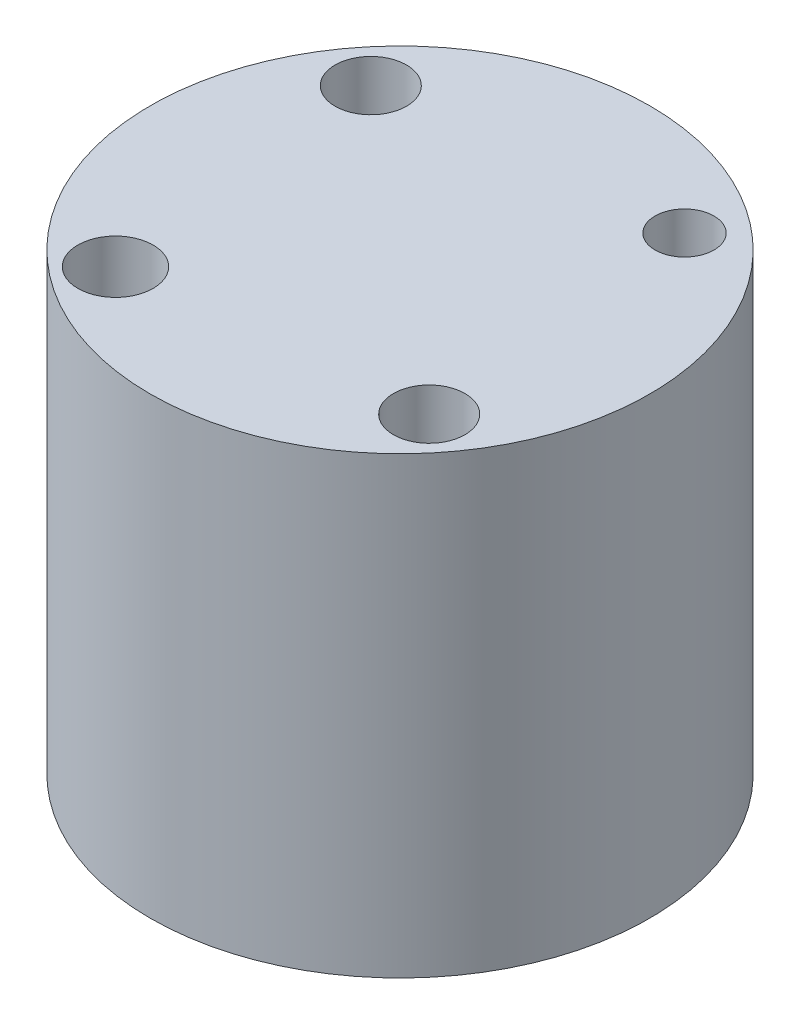
ISO-10303-21;
HEADER;
FILE_DESCRIPTION(('STEP AP214'),'2;1');
FILE_NAME('part.step','',(''),(''),'','','');
FILE_SCHEMA(('AUTOMOTIVE_DESIGN { 1 0 10303 214 1 1 1 1 }'));
ENDSEC;
DATA;
#1=APPLICATION_CONTEXT('core data for automotive mechanical design processes');
#2=APPLICATION_PROTOCOL_DEFINITION('international standard','automotive_design',2000,#1);
#3=PRODUCT_CONTEXT('',#1,'mechanical');
#4=PRODUCT('Part','Part','',(#3));
#5=PRODUCT_RELATED_PRODUCT_CATEGORY('part','',(#4));
#6=PRODUCT_DEFINITION_FORMATION('','',#4);
#7=PRODUCT_DEFINITION_CONTEXT('part definition',#1,'design');
#8=PRODUCT_DEFINITION('design','',#6,#7);
#9=PRODUCT_DEFINITION_SHAPE('','',#8);
#10=(LENGTH_UNIT() NAMED_UNIT(*) SI_UNIT(.MILLI.,.METRE.));
#11=(NAMED_UNIT(*) PLANE_ANGLE_UNIT() SI_UNIT($,.RADIAN.));
#12=(NAMED_UNIT(*) SI_UNIT($,.STERADIAN.) SOLID_ANGLE_UNIT());
#13=UNCERTAINTY_MEASURE_WITH_UNIT(LENGTH_MEASURE(1.E-05),#10,'distance_accuracy_value','');
#14=(GEOMETRIC_REPRESENTATION_CONTEXT(3) GLOBAL_UNCERTAINTY_ASSIGNED_CONTEXT((#13)) GLOBAL_UNIT_ASSIGNED_CONTEXT((#10,
#11,#12)) REPRESENTATION_CONTEXT('',''));
#15=CARTESIAN_POINT('',(0.,0.,0.));
#16=DIRECTION('',(0.,0.,1.));
#17=DIRECTION('',(1.,0.,0.));
#18=AXIS2_PLACEMENT_3D('',#15,#16,#17);
#19=CARTESIAN_POINT('',(0.,25.4,0.));
#20=DIRECTION('',(0.,1.,0.));
#21=DIRECTION('',(0.,0.,1.));
#22=AXIS2_PLACEMENT_3D('',#19,#20,#21);
#23=PLANE('',#22);
#24=CARTESIAN_POINT('',(-7.14125785822685,25.4,8.77510320180453));
#25=DIRECTION('',(0.,1.,0.));
#26=DIRECTION('',(0.,0.,1.));
#27=AXIS2_PLACEMENT_3D('',#24,#25,#26);
#28=CIRCLE('',#27,2.10499005802712);
#29=CARTESIAN_POINT('',(-7.14125785822685,25.4,10.8800932598317));
#30=VERTEX_POINT('',#29);
#31=EDGE_CURVE('E53',#30,#30,#28,.T.);
#32=ORIENTED_EDGE('',*,*,#31,.F.);
#33=EDGE_LOOP('',(#32));
#34=FACE_BOUND('',#33,.T.);
#35=CARTESIAN_POINT('',(-8.77510320180262,25.4,-7.1412578582266));
#36=DIRECTION('',(0.,1.,0.));
#37=DIRECTION('',(0.,0.,1.));
#38=AXIS2_PLACEMENT_3D('',#35,#36,#37);
#39=CIRCLE('',#38,2.);
#40=CARTESIAN_POINT('',(-8.77510320180262,25.4,-5.1412578582266));
#41=VERTEX_POINT('',#40);
#42=EDGE_CURVE('E42',#41,#41,#39,.T.);
#43=ORIENTED_EDGE('',*,*,#42,.F.);
#44=EDGE_LOOP('',(#43));
#45=FACE_BOUND('',#44,.T.);
#46=CARTESIAN_POINT('',(0.,25.4,0.));
#47=DIRECTION('',(0.,1.,0.));
#48=DIRECTION('',(0.,0.,1.));
#49=AXIS2_PLACEMENT_3D('',#46,#47,#48);
#50=CIRCLE('',#49,13.97);
#51=CARTESIAN_POINT('',(0.,25.4,13.97));
#52=VERTEX_POINT('',#51);
#53=EDGE_CURVE('E10',#52,#52,#50,.T.);
#54=ORIENTED_EDGE('',*,*,#53,.T.);
#55=EDGE_LOOP('',(#54));
#56=FACE_BOUND('',#55,.T.);
#57=CARTESIAN_POINT('',(7.14125785822851,25.4,-8.77510320180233));
#58=DIRECTION('',(0.,1.,0.));
#59=DIRECTION('',(0.,0.,1.));
#60=AXIS2_PLACEMENT_3D('',#57,#58,#59);
#61=CIRCLE('',#60,1.64999999999999);
#62=CARTESIAN_POINT('',(7.14125785822851,25.4,-7.12510320180234));
#63=VERTEX_POINT('',#62);
#64=EDGE_CURVE('E47',#63,#63,#61,.T.);
#65=ORIENTED_EDGE('',*,*,#64,.F.);
#66=EDGE_LOOP('',(#65));
#67=FACE_BOUND('',#66,.T.);
#68=CARTESIAN_POINT('',(8.77510320180428,25.4,7.14125785822882));
#69=DIRECTION('',(0.,1.,0.));
#70=DIRECTION('',(0.,0.,1.));
#71=AXIS2_PLACEMENT_3D('',#68,#69,#70);
#72=CIRCLE('',#71,2.);
#73=CARTESIAN_POINT('',(8.77510320180428,25.4,9.14125785822882));
#74=VERTEX_POINT('',#73);
#75=EDGE_CURVE('E59',#74,#74,#72,.T.);
#76=ORIENTED_EDGE('',*,*,#75,.F.);
#77=EDGE_LOOP('',(#76));
#78=FACE_BOUND('',#77,.T.);
#79=ADVANCED_FACE('F31',(#34,#45,#56,#67,#78),#23,.T.);
#80=CARTESIAN_POINT('',(0.,0.,0.));
#81=DIRECTION('',(0.,1.,0.));
#82=DIRECTION('',(0.,0.,1.));
#83=AXIS2_PLACEMENT_3D('',#80,#81,#82);
#84=PLANE('',#83);
#85=CARTESIAN_POINT('',(0.,0.,0.));
#86=DIRECTION('',(0.,1.,0.));
#87=DIRECTION('',(0.,0.,1.));
#88=AXIS2_PLACEMENT_3D('',#85,#86,#87);
#89=CIRCLE('',#88,13.97);
#90=CARTESIAN_POINT('',(0.,0.,13.97));
#91=VERTEX_POINT('',#90);
#92=EDGE_CURVE('E35',#91,#91,#89,.T.);
#93=ORIENTED_EDGE('',*,*,#92,.F.);
#94=EDGE_LOOP('',(#93));
#95=FACE_BOUND('',#94,.T.);
#96=CARTESIAN_POINT('',(-8.77510320180262,0.,-7.1412578582266));
#97=DIRECTION('',(0.,1.,0.));
#98=DIRECTION('',(0.,0.,1.));
#99=AXIS2_PLACEMENT_3D('',#96,#97,#98);
#100=CIRCLE('',#99,2.);
#101=CARTESIAN_POINT('',(-8.77510320180262,0.,-5.1412578582266));
#102=VERTEX_POINT('',#101);
#103=EDGE_CURVE('E44',#102,#102,#100,.T.);
#104=ORIENTED_EDGE('',*,*,#103,.T.);
#105=EDGE_LOOP('',(#104));
#106=FACE_BOUND('',#105,.T.);
#107=CARTESIAN_POINT('',(7.14125785822851,0.,-8.77510320180233));
#108=DIRECTION('',(0.,1.,0.));
#109=DIRECTION('',(0.,0.,1.));
#110=AXIS2_PLACEMENT_3D('',#107,#108,#109);
#111=CIRCLE('',#110,1.64999999999999);
#112=CARTESIAN_POINT('',(7.14125785822851,0.,-7.12510320180234));
#113=VERTEX_POINT('',#112);
#114=EDGE_CURVE('E50',#113,#113,#111,.T.);
#115=ORIENTED_EDGE('',*,*,#114,.T.);
#116=EDGE_LOOP('',(#115));
#117=FACE_BOUND('',#116,.T.);
#118=CARTESIAN_POINT('',(-7.14125785822685,0.,8.77510320180453));
#119=DIRECTION('',(0.,1.,0.));
#120=DIRECTION('',(0.,0.,1.));
#121=AXIS2_PLACEMENT_3D('',#118,#119,#120);
#122=CIRCLE('',#121,2.10499005802712);
#123=CARTESIAN_POINT('',(-7.14125785822685,0.,10.8800932598317));
#124=VERTEX_POINT('',#123);
#125=EDGE_CURVE('E56',#124,#124,#122,.T.);
#126=ORIENTED_EDGE('',*,*,#125,.T.);
#127=EDGE_LOOP('',(#126));
#128=FACE_BOUND('',#127,.T.);
#129=CARTESIAN_POINT('',(8.77510320180428,0.,7.14125785822882));
#130=DIRECTION('',(0.,1.,0.));
#131=DIRECTION('',(0.,0.,1.));
#132=AXIS2_PLACEMENT_3D('',#129,#130,#131);
#133=CIRCLE('',#132,2.);
#134=CARTESIAN_POINT('',(8.77510320180428,0.,9.14125785822882));
#135=VERTEX_POINT('',#134);
#136=EDGE_CURVE('E62',#135,#135,#133,.T.);
#137=ORIENTED_EDGE('',*,*,#136,.T.);
#138=EDGE_LOOP('',(#137));
#139=FACE_BOUND('',#138,.T.);
#140=ADVANCED_FACE('F72',(#95,#106,#117,#128,#139),#84,.F.);
#141=CARTESIAN_POINT('',(0.,25.4,0.));
#142=DIRECTION('',(0.,-1.,0.));
#143=DIRECTION('',(0.,0.,-1.));
#144=AXIS2_PLACEMENT_3D('',#141,#142,#143);
#145=CYLINDRICAL_SURFACE('',#144,13.97);
#146=ORIENTED_EDGE('',*,*,#53,.F.);
#147=EDGE_LOOP('',(#146));
#148=FACE_BOUND('',#147,.T.);
#149=ORIENTED_EDGE('',*,*,#92,.T.);
#150=EDGE_LOOP('',(#149));
#151=FACE_BOUND('',#150,.T.);
#152=ADVANCED_FACE('F33',(#148,#151),#145,.T.);
#153=CARTESIAN_POINT('',(-8.77510320180262,25.4,-7.1412578582266));
#154=DIRECTION('',(0.,-1.,0.));
#155=DIRECTION('',(0.,0.,-1.));
#156=AXIS2_PLACEMENT_3D('',#153,#154,#155);
#157=CYLINDRICAL_SURFACE('',#156,2.);
#158=ORIENTED_EDGE('',*,*,#42,.T.);
#159=EDGE_LOOP('',(#158));
#160=FACE_BOUND('',#159,.T.);
#161=ORIENTED_EDGE('',*,*,#103,.F.);
#162=EDGE_LOOP('',(#161));
#163=FACE_BOUND('',#162,.T.);
#164=ADVANCED_FACE('F82',(#160,#163),#157,.F.);
#165=CARTESIAN_POINT('',(7.14125785822851,25.4,-8.77510320180233));
#166=DIRECTION('',(0.,-1.,0.));
#167=DIRECTION('',(0.,0.,-1.));
#168=AXIS2_PLACEMENT_3D('',#165,#166,#167);
#169=CYLINDRICAL_SURFACE('',#168,1.64999999999999);
#170=ORIENTED_EDGE('',*,*,#64,.T.);
#171=EDGE_LOOP('',(#170));
#172=FACE_BOUND('',#171,.T.);
#173=ORIENTED_EDGE('',*,*,#114,.F.);
#174=EDGE_LOOP('',(#173));
#175=FACE_BOUND('',#174,.T.);
#176=ADVANCED_FACE('F85',(#172,#175),#169,.F.);
#177=CARTESIAN_POINT('',(-7.14125785822685,25.4,8.77510320180453));
#178=DIRECTION('',(0.,-1.,0.));
#179=DIRECTION('',(0.,0.,-1.));
#180=AXIS2_PLACEMENT_3D('',#177,#178,#179);
#181=CYLINDRICAL_SURFACE('',#180,2.10499005802712);
#182=ORIENTED_EDGE('',*,*,#31,.T.);
#183=EDGE_LOOP('',(#182));
#184=FACE_BOUND('',#183,.T.);
#185=ORIENTED_EDGE('',*,*,#125,.F.);
#186=EDGE_LOOP('',(#185));
#187=FACE_BOUND('',#186,.T.);
#188=ADVANCED_FACE('F89',(#184,#187),#181,.F.);
#189=CARTESIAN_POINT('',(8.77510320180428,25.4,7.14125785822882));
#190=DIRECTION('',(0.,-1.,0.));
#191=DIRECTION('',(0.,0.,-1.));
#192=AXIS2_PLACEMENT_3D('',#189,#190,#191);
#193=CYLINDRICAL_SURFACE('',#192,2.);
#194=ORIENTED_EDGE('',*,*,#75,.T.);
#195=EDGE_LOOP('',(#194));
#196=FACE_BOUND('',#195,.T.);
#197=ORIENTED_EDGE('',*,*,#136,.F.);
#198=EDGE_LOOP('',(#197));
#199=FACE_BOUND('',#198,.T.);
#200=ADVANCED_FACE('F68',(#196,#199),#193,.F.);
#201=CLOSED_SHELL('',(#79,#140,#152,#164,#176,#188,#200));
#202=MANIFOLD_SOLID_BREP('B2',#201);
#203=ADVANCED_BREP_SHAPE_REPRESENTATION('',(#18,#202),#14);
#204=SHAPE_DEFINITION_REPRESENTATION(#9,#203);
ENDSEC;
END-ISO-10303-21;
